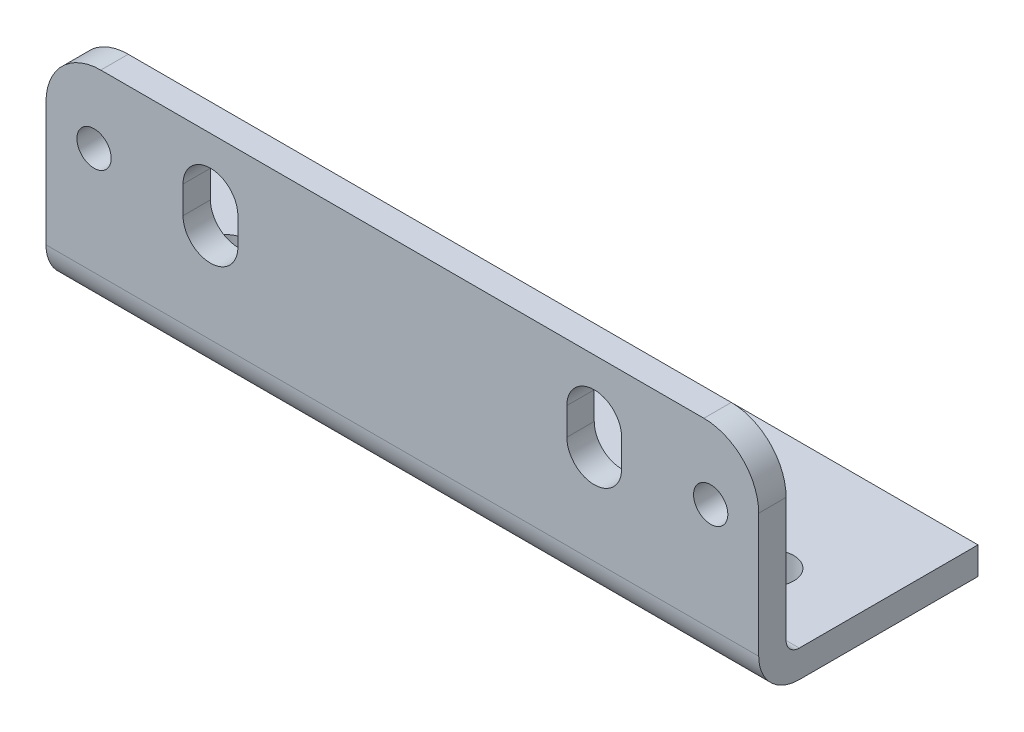
ISO-10303-21;
HEADER;
FILE_DESCRIPTION(('STEP AP214'),'2;1');
FILE_NAME('part.step','',(''),(''),'','','');
FILE_SCHEMA(('AUTOMOTIVE_DESIGN { 1 0 10303 214 1 1 1 1 }'));
ENDSEC;
DATA;
#1=APPLICATION_CONTEXT('core data for automotive mechanical design processes');
#2=APPLICATION_PROTOCOL_DEFINITION('international standard','automotive_design',2000,#1);
#3=PRODUCT_CONTEXT('',#1,'mechanical');
#4=PRODUCT('Part','Part','',(#3));
#5=PRODUCT_RELATED_PRODUCT_CATEGORY('part','',(#4));
#6=PRODUCT_DEFINITION_FORMATION('','',#4);
#7=PRODUCT_DEFINITION_CONTEXT('part definition',#1,'design');
#8=PRODUCT_DEFINITION('design','',#6,#7);
#9=PRODUCT_DEFINITION_SHAPE('','',#8);
#10=(LENGTH_UNIT() NAMED_UNIT(*) SI_UNIT(.MILLI.,.METRE.));
#11=(NAMED_UNIT(*) PLANE_ANGLE_UNIT() SI_UNIT($,.RADIAN.));
#12=(NAMED_UNIT(*) SI_UNIT($,.STERADIAN.) SOLID_ANGLE_UNIT());
#13=UNCERTAINTY_MEASURE_WITH_UNIT(LENGTH_MEASURE(1.E-05),#10,'distance_accuracy_value','');
#14=(GEOMETRIC_REPRESENTATION_CONTEXT(3) GLOBAL_UNCERTAINTY_ASSIGNED_CONTEXT((#13)) GLOBAL_UNIT_ASSIGNED_CONTEXT((#10,
#11,#12)) REPRESENTATION_CONTEXT('',''));
#15=CARTESIAN_POINT('',(0.,0.,0.));
#16=DIRECTION('',(0.,0.,1.));
#17=DIRECTION('',(1.,0.,0.));
#18=AXIS2_PLACEMENT_3D('',#15,#16,#17);
#19=CARTESIAN_POINT('',(-41.275,25.4,0.));
#20=DIRECTION('',(0.,-1.,0.));
#21=DIRECTION('',(0.,0.,-1.));
#22=AXIS2_PLACEMENT_3D('',#19,#20,#21);
#23=PLANE('',#22);
#24=DIRECTION('',(0.,0.,1.));
#25=VECTOR('',#24,1.);
#26=CARTESIAN_POINT('',(34.925,25.4000000000004,-4.69899999999999));
#27=LINE('',#26,#25);
#28=CARTESIAN_POINT('',(34.925,25.4000000000004,-3.17499999999998));
#29=VERTEX_POINT('',#28);
#30=CARTESIAN_POINT('',(34.925,25.4000000000004,0.));
#31=VERTEX_POINT('',#30);
#32=EDGE_CURVE('E153',#29,#31,#27,.T.);
#33=ORIENTED_EDGE('',*,*,#32,.F.);
#34=DIRECTION('',(1.,0.,0.));
#35=VECTOR('',#34,1.);
#36=CARTESIAN_POINT('',(-41.275,25.4,-3.17499999999992));
#37=LINE('',#36,#35);
#38=CARTESIAN_POINT('',(-34.925,25.4,-3.17499999999993));
#39=VERTEX_POINT('',#38);
#40=EDGE_CURVE('E245',#29,#39,#37,.F.);
#41=ORIENTED_EDGE('',*,*,#40,.T.);
#42=DIRECTION('',(0.,0.,1.));
#43=VECTOR('',#42,1.);
#44=CARTESIAN_POINT('',(-34.925,25.4,0.));
#45=LINE('',#44,#43);
#46=CARTESIAN_POINT('',(-34.925,25.4,0.));
#47=VERTEX_POINT('',#46);
#48=EDGE_CURVE('E195',#47,#39,#45,.F.);
#49=ORIENTED_EDGE('',*,*,#48,.F.);
#50=DIRECTION('',(1.,0.,0.));
#51=VECTOR('',#50,1.);
#52=CARTESIAN_POINT('',(-41.275,25.4,0.));
#53=LINE('',#52,#51);
#54=EDGE_CURVE('E156',#31,#47,#53,.F.);
#55=ORIENTED_EDGE('',*,*,#54,.F.);
#56=EDGE_LOOP('',(#33,#41,#49,#55));
#57=FACE_BOUND('',#56,.T.);
#58=ADVANCED_FACE('F25',(#57),#23,.F.);
#59=CARTESIAN_POINT('',(-25.4,15.5575000000004,-90.0267876801122));
#60=DIRECTION('',(1.,0.,0.));
#61=DIRECTION('',(0.,0.,-1.));
#62=AXIS2_PLACEMENT_3D('',#59,#60,#61);
#63=PLANE('',#62);
#64=DIRECTION('',(0.,1.,0.));
#65=VECTOR('',#64,1.);
#66=CARTESIAN_POINT('',(-25.4000000000001,4.44089209850063E-13,0.));
#67=LINE('',#66,#65);
#68=CARTESIAN_POINT('',(-25.4000000000001,15.5575000000004,0.));
#69=VERTEX_POINT('',#68);
#70=CARTESIAN_POINT('',(-25.4000000000002,18.7325000000004,0.));
#71=VERTEX_POINT('',#70);
#72=EDGE_CURVE('E265',#69,#71,#67,.T.);
#73=ORIENTED_EDGE('',*,*,#72,.F.);
#74=DIRECTION('',(0.,0.,-1.));
#75=VECTOR('',#74,1.);
#76=CARTESIAN_POINT('',(-25.4,15.5575000000004,-90.0267876801122));
#77=LINE('',#76,#75);
#78=CARTESIAN_POINT('',(-25.4000000000001,15.5575000000004,-3.17499999999996));
#79=VERTEX_POINT('',#78);
#80=EDGE_CURVE('E185',#69,#79,#77,.T.);
#81=ORIENTED_EDGE('',*,*,#80,.T.);
#82=DIRECTION('',(0.,1.,0.));
#83=VECTOR('',#82,1.);
#84=CARTESIAN_POINT('',(-25.4000000000001,4.44089209850063E-13,-3.17499999999999));
#85=LINE('',#84,#83);
#86=CARTESIAN_POINT('',(-25.4000000000002,18.7325000000004,-3.17499999999995));
#87=VERTEX_POINT('',#86);
#88=EDGE_CURVE('E242',#79,#87,#85,.T.);
#89=ORIENTED_EDGE('',*,*,#88,.T.);
#90=DIRECTION('',(0.,0.,-1.));
#91=VECTOR('',#90,1.);
#92=CARTESIAN_POINT('',(-25.4,18.7325000000004,-90.0267876801122));
#93=LINE('',#92,#91);
#94=EDGE_CURVE('E192',#87,#71,#93,.F.);
#95=ORIENTED_EDGE('',*,*,#94,.T.);
#96=EDGE_LOOP('',(#73,#81,#89,#95));
#97=FACE_BOUND('',#96,.T.);
#98=ADVANCED_FACE('F521',(#97),#63,.T.);
#99=CARTESIAN_POINT('',(-22.225,18.7325000000004,-90.0267876801123));
#100=DIRECTION('',(0.,0.,-1.));
#101=DIRECTION('',(-1.,0.,0.));
#102=AXIS2_PLACEMENT_3D('',#99,#100,#101);
#103=CYLINDRICAL_SURFACE('',#102,3.175);
#104=DIRECTION('',(0.,0.,1.));
#105=VECTOR('',#104,1.);
#106=CARTESIAN_POINT('',(-19.05,18.7325,-90.0267876801123));
#107=LINE('',#106,#105);
#108=CARTESIAN_POINT('',(-19.0500000000001,18.7325,0.));
#109=VERTEX_POINT('',#108);
#110=CARTESIAN_POINT('',(-19.0500000000001,18.7325,-3.17499999999995));
#111=VERTEX_POINT('',#110);
#112=EDGE_CURVE('E189',#109,#111,#107,.F.);
#113=ORIENTED_EDGE('',*,*,#112,.F.);
#114=CARTESIAN_POINT('',(-22.2250000000001,18.7325000000004,0.));
#115=DIRECTION('',(0.,0.,-1.));
#116=DIRECTION('',(-1.,0.,0.));
#117=AXIS2_PLACEMENT_3D('',#114,#115,#116);
#118=CIRCLE('',#117,3.175);
#119=EDGE_CURVE('E263',#71,#109,#118,.T.);
#120=ORIENTED_EDGE('',*,*,#119,.F.);
#121=ORIENTED_EDGE('',*,*,#94,.F.);
#122=CARTESIAN_POINT('',(-22.2250000000001,18.7325000000004,-3.17499999999995));
#123=DIRECTION('',(0.,0.,-1.));
#124=DIRECTION('',(-1.,0.,0.));
#125=AXIS2_PLACEMENT_3D('',#122,#123,#124);
#126=CIRCLE('',#125,3.175);
#127=EDGE_CURVE('E240',#87,#111,#126,.T.);
#128=ORIENTED_EDGE('',*,*,#127,.T.);
#129=EDGE_LOOP('',(#113,#120,#121,#128));
#130=FACE_BOUND('',#129,.T.);
#131=ADVANCED_FACE('F513',(#130),#103,.F.);
#132=CARTESIAN_POINT('',(-19.05,18.7325,-90.0267876801123));
#133=DIRECTION('',(-1.,0.,0.));
#134=DIRECTION('',(0.,0.,1.));
#135=AXIS2_PLACEMENT_3D('',#132,#133,#134);
#136=PLANE('',#135);
#137=DIRECTION('',(0.,1.,0.));
#138=VECTOR('',#137,1.);
#139=CARTESIAN_POINT('',(-19.05,0.,0.));
#140=LINE('',#139,#138);
#141=CARTESIAN_POINT('',(-19.05,15.5575,0.));
#142=VERTEX_POINT('',#141);
#143=EDGE_CURVE('E268',#109,#142,#140,.F.);
#144=ORIENTED_EDGE('',*,*,#143,.F.);
#145=ORIENTED_EDGE('',*,*,#112,.T.);
#146=DIRECTION('',(0.,1.,0.));
#147=VECTOR('',#146,1.);
#148=CARTESIAN_POINT('',(-19.05,0.,-3.17499999999999));
#149=LINE('',#148,#147);
#150=CARTESIAN_POINT('',(-19.05,15.5575,-3.17499999999996));
#151=VERTEX_POINT('',#150);
#152=EDGE_CURVE('E239',#111,#151,#149,.F.);
#153=ORIENTED_EDGE('',*,*,#152,.T.);
#154=DIRECTION('',(0.,0.,-1.));
#155=VECTOR('',#154,1.);
#156=CARTESIAN_POINT('',(-19.05,15.5575,-90.0267876801123));
#157=LINE('',#156,#155);
#158=EDGE_CURVE('E187',#151,#142,#157,.F.);
#159=ORIENTED_EDGE('',*,*,#158,.T.);
#160=EDGE_LOOP('',(#144,#145,#153,#159));
#161=FACE_BOUND('',#160,.T.);
#162=ADVANCED_FACE('F505',(#161),#136,.T.);
#163=CARTESIAN_POINT('',(-22.225,15.5575000000004,-90.0267876801123));
#164=DIRECTION('',(0.,0.,-1.));
#165=DIRECTION('',(-1.,0.,0.));
#166=AXIS2_PLACEMENT_3D('',#163,#164,#165);
#167=CYLINDRICAL_SURFACE('',#166,3.175);
#168=ORIENTED_EDGE('',*,*,#80,.F.);
#169=CARTESIAN_POINT('',(-22.225,15.5575000000004,0.));
#170=DIRECTION('',(0.,0.,-1.));
#171=DIRECTION('',(-1.,0.,0.));
#172=AXIS2_PLACEMENT_3D('',#169,#170,#171);
#173=CIRCLE('',#172,3.175);
#174=EDGE_CURVE('E266',#142,#69,#173,.T.);
#175=ORIENTED_EDGE('',*,*,#174,.F.);
#176=ORIENTED_EDGE('',*,*,#158,.F.);
#177=CARTESIAN_POINT('',(-22.225,15.5575000000004,-3.17499999999995));
#178=DIRECTION('',(0.,0.,-1.));
#179=DIRECTION('',(-1.,0.,0.));
#180=AXIS2_PLACEMENT_3D('',#177,#178,#179);
#181=CIRCLE('',#180,3.175);
#182=EDGE_CURVE('E236',#151,#79,#181,.T.);
#183=ORIENTED_EDGE('',*,*,#182,.T.);
#184=EDGE_LOOP('',(#168,#175,#176,#183));
#185=FACE_BOUND('',#184,.T.);
#186=ADVANCED_FACE('F497',(#185),#167,.F.);
#187=CARTESIAN_POINT('',(19.0500000000001,15.5575,-90.0267876801122));
#188=DIRECTION('',(1.,0.,0.));
#189=DIRECTION('',(0.,0.,-1.));
#190=AXIS2_PLACEMENT_3D('',#187,#188,#189);
#191=PLANE('',#190);
#192=DIRECTION('',(0.,1.,0.));
#193=VECTOR('',#192,1.);
#194=CARTESIAN_POINT('',(19.05,0.,0.));
#195=LINE('',#194,#193);
#196=CARTESIAN_POINT('',(19.05,15.5575,0.));
#197=VERTEX_POINT('',#196);
#198=CARTESIAN_POINT('',(19.05,18.7325,0.));
#199=VERTEX_POINT('',#198);
#200=EDGE_CURVE('E258',#197,#199,#195,.T.);
#201=ORIENTED_EDGE('',*,*,#200,.F.);
#202=DIRECTION('',(0.,0.,-1.));
#203=VECTOR('',#202,1.);
#204=CARTESIAN_POINT('',(19.0500000000001,15.5575,-90.0267876801122));
#205=LINE('',#204,#203);
#206=CARTESIAN_POINT('',(19.0500000000001,15.5575,-3.17499999999998));
#207=VERTEX_POINT('',#206);
#208=EDGE_CURVE('E176',#197,#207,#205,.T.);
#209=ORIENTED_EDGE('',*,*,#208,.T.);
#210=DIRECTION('',(0.,1.,0.));
#211=VECTOR('',#210,1.);
#212=CARTESIAN_POINT('',(19.0500000000001,0.,-3.17500000000001));
#213=LINE('',#212,#211);
#214=CARTESIAN_POINT('',(19.05,18.7325,-3.17499999999998));
#215=VERTEX_POINT('',#214);
#216=EDGE_CURVE('E235',#207,#215,#213,.T.);
#217=ORIENTED_EDGE('',*,*,#216,.T.);
#218=DIRECTION('',(0.,0.,-1.));
#219=VECTOR('',#218,1.);
#220=CARTESIAN_POINT('',(19.05,18.7325,-90.0267876801122));
#221=LINE('',#220,#219);
#222=EDGE_CURVE('E183',#215,#199,#221,.F.);
#223=ORIENTED_EDGE('',*,*,#222,.T.);
#224=EDGE_LOOP('',(#201,#209,#217,#223));
#225=FACE_BOUND('',#224,.T.);
#226=ADVANCED_FACE('F489',(#225),#191,.T.);
#227=CARTESIAN_POINT('',(22.225,18.7325,-90.0267876801123));
#228=DIRECTION('',(0.,0.,-1.));
#229=DIRECTION('',(-1.,0.,0.));
#230=AXIS2_PLACEMENT_3D('',#227,#228,#229);
#231=CYLINDRICAL_SURFACE('',#230,3.175);
#232=DIRECTION('',(0.,0.,1.));
#233=VECTOR('',#232,1.);
#234=CARTESIAN_POINT('',(25.4000000000001,18.7325,-90.0267876801123));
#235=LINE('',#234,#233);
#236=CARTESIAN_POINT('',(25.4,18.7325,0.));
#237=VERTEX_POINT('',#236);
#238=CARTESIAN_POINT('',(25.4000000000001,18.7325,-3.17499999999998));
#239=VERTEX_POINT('',#238);
#240=EDGE_CURVE('E180',#237,#239,#235,.F.);
#241=ORIENTED_EDGE('',*,*,#240,.F.);
#242=CARTESIAN_POINT('',(22.225,18.7325,0.));
#243=DIRECTION('',(0.,0.,-1.));
#244=DIRECTION('',(-1.,0.,0.));
#245=AXIS2_PLACEMENT_3D('',#242,#243,#244);
#246=CIRCLE('',#245,3.175);
#247=EDGE_CURVE('E255',#199,#237,#246,.T.);
#248=ORIENTED_EDGE('',*,*,#247,.F.);
#249=ORIENTED_EDGE('',*,*,#222,.F.);
#250=CARTESIAN_POINT('',(22.225,18.7325,-3.17499999999998));
#251=DIRECTION('',(0.,0.,-1.));
#252=DIRECTION('',(-1.,0.,0.));
#253=AXIS2_PLACEMENT_3D('',#250,#251,#252);
#254=CIRCLE('',#253,3.175);
#255=EDGE_CURVE('E233',#215,#239,#254,.T.);
#256=ORIENTED_EDGE('',*,*,#255,.T.);
#257=EDGE_LOOP('',(#241,#248,#249,#256));
#258=FACE_BOUND('',#257,.T.);
#259=ADVANCED_FACE('F481',(#258),#231,.F.);
#260=CARTESIAN_POINT('',(25.4000000000001,18.7325,-90.0267876801123));
#261=DIRECTION('',(-1.,0.,0.));
#262=DIRECTION('',(0.,0.,1.));
#263=AXIS2_PLACEMENT_3D('',#260,#261,#262);
#264=PLANE('',#263);
#265=DIRECTION('',(0.,1.,0.));
#266=VECTOR('',#265,1.);
#267=CARTESIAN_POINT('',(25.4000000000001,0.,0.));
#268=LINE('',#267,#266);
#269=CARTESIAN_POINT('',(25.4000000000001,15.5575,0.));
#270=VERTEX_POINT('',#269);
#271=EDGE_CURVE('E262',#237,#270,#268,.F.);
#272=ORIENTED_EDGE('',*,*,#271,.F.);
#273=ORIENTED_EDGE('',*,*,#240,.T.);
#274=DIRECTION('',(0.,1.,0.));
#275=VECTOR('',#274,1.);
#276=CARTESIAN_POINT('',(25.4000000000001,0.,-3.17500000000002));
#277=LINE('',#276,#275);
#278=CARTESIAN_POINT('',(25.4000000000001,15.5575,-3.17499999999999));
#279=VERTEX_POINT('',#278);
#280=EDGE_CURVE('E232',#239,#279,#277,.F.);
#281=ORIENTED_EDGE('',*,*,#280,.T.);
#282=DIRECTION('',(0.,0.,-1.));
#283=VECTOR('',#282,1.);
#284=CARTESIAN_POINT('',(25.4000000000001,15.5575,-90.0267876801123));
#285=LINE('',#284,#283);
#286=EDGE_CURVE('E178',#279,#270,#285,.F.);
#287=ORIENTED_EDGE('',*,*,#286,.T.);
#288=EDGE_LOOP('',(#272,#273,#281,#287));
#289=FACE_BOUND('',#288,.T.);
#290=ADVANCED_FACE('F473',(#289),#264,.T.);
#291=CARTESIAN_POINT('',(22.2250000000001,15.5575,-90.0267876801122));
#292=DIRECTION('',(0.,0.,-1.));
#293=DIRECTION('',(-1.,0.,0.));
#294=AXIS2_PLACEMENT_3D('',#291,#292,#293);
#295=CYLINDRICAL_SURFACE('',#294,3.175);
#296=ORIENTED_EDGE('',*,*,#208,.F.);
#297=CARTESIAN_POINT('',(22.2250000000001,15.5575,0.));
#298=DIRECTION('',(0.,0.,-1.));
#299=DIRECTION('',(-1.,0.,0.));
#300=AXIS2_PLACEMENT_3D('',#297,#298,#299);
#301=CIRCLE('',#300,3.175);
#302=EDGE_CURVE('E259',#270,#197,#301,.T.);
#303=ORIENTED_EDGE('',*,*,#302,.F.);
#304=ORIENTED_EDGE('',*,*,#286,.F.);
#305=CARTESIAN_POINT('',(22.2250000000001,15.5575,-3.17499999999999));
#306=DIRECTION('',(0.,0.,-1.));
#307=DIRECTION('',(-1.,0.,0.));
#308=AXIS2_PLACEMENT_3D('',#305,#306,#307);
#309=CIRCLE('',#308,3.175);
#310=EDGE_CURVE('E229',#279,#207,#309,.T.);
#311=ORIENTED_EDGE('',*,*,#310,.T.);
#312=EDGE_LOOP('',(#296,#303,#304,#311));
#313=FACE_BOUND('',#312,.T.);
#314=ADVANCED_FACE('F465',(#313),#295,.F.);
#315=CARTESIAN_POINT('',(-35.7124,17.145,-90.0267876801121));
#316=DIRECTION('',(0.,0.,-1.));
#317=DIRECTION('',(-1.,0.,0.));
#318=AXIS2_PLACEMENT_3D('',#315,#316,#317);
#319=CYLINDRICAL_SURFACE('',#318,1.984375);
#320=CARTESIAN_POINT('',(-35.7124,17.145,0.));
#321=DIRECTION('',(0.,0.,-1.));
#322=DIRECTION('',(-1.,0.,0.));
#323=AXIS2_PLACEMENT_3D('',#320,#321,#322);
#324=CIRCLE('',#323,1.984375);
#325=CARTESIAN_POINT('',(-37.696775,17.145,0.));
#326=VERTEX_POINT('',#325);
#327=EDGE_CURVE('E252',#326,#326,#324,.T.);
#328=ORIENTED_EDGE('',*,*,#327,.F.);
#329=EDGE_LOOP('',(#328));
#330=FACE_BOUND('',#329,.T.);
#331=CARTESIAN_POINT('',(-35.7124,17.145,-3.17499999999995));
#332=DIRECTION('',(0.,0.,-1.));
#333=DIRECTION('',(-1.,0.,0.));
#334=AXIS2_PLACEMENT_3D('',#331,#332,#333);
#335=CIRCLE('',#334,1.984375);
#336=CARTESIAN_POINT('',(-37.696775,17.145,-3.17499999999994));
#337=VERTEX_POINT('',#336);
#338=EDGE_CURVE('E226',#337,#337,#335,.T.);
#339=ORIENTED_EDGE('',*,*,#338,.T.);
#340=EDGE_LOOP('',(#339));
#341=FACE_BOUND('',#340,.T.);
#342=ADVANCED_FACE('F457',(#330,#341),#319,.F.);
#343=CARTESIAN_POINT('',(35.7124000000002,17.145,-90.0267876801122));
#344=DIRECTION('',(0.,0.,-1.));
#345=DIRECTION('',(-1.,0.,0.));
#346=AXIS2_PLACEMENT_3D('',#343,#344,#345);
#347=CYLINDRICAL_SURFACE('',#346,1.984375);
#348=CARTESIAN_POINT('',(35.7124000000002,17.1450000000004,0.));
#349=DIRECTION('',(0.,0.,-1.));
#350=DIRECTION('',(-1.,0.,0.));
#351=AXIS2_PLACEMENT_3D('',#348,#349,#350);
#352=CIRCLE('',#351,1.984375);
#353=CARTESIAN_POINT('',(33.7280250000002,17.1450000000004,0.));
#354=VERTEX_POINT('',#353);
#355=EDGE_CURVE('E249',#354,#354,#352,.T.);
#356=ORIENTED_EDGE('',*,*,#355,.F.);
#357=EDGE_LOOP('',(#356));
#358=FACE_BOUND('',#357,.T.);
#359=CARTESIAN_POINT('',(35.7124000000002,17.1450000000004,-3.17499999999999));
#360=DIRECTION('',(0.,0.,-1.));
#361=DIRECTION('',(-1.,0.,0.));
#362=AXIS2_PLACEMENT_3D('',#359,#360,#361);
#363=CIRCLE('',#362,1.984375);
#364=CARTESIAN_POINT('',(33.7280250000002,17.1450000000004,-3.17499999999999));
#365=VERTEX_POINT('',#364);
#366=EDGE_CURVE('E222',#365,#365,#363,.T.);
#367=ORIENTED_EDGE('',*,*,#366,.T.);
#368=EDGE_LOOP('',(#367));
#369=FACE_BOUND('',#368,.T.);
#370=ADVANCED_FACE('F450',(#358,#369),#347,.F.);
#371=CARTESIAN_POINT('',(34.925,19.0500000000005,-4.699));
#372=DIRECTION('',(0.,0.,1.));
#373=DIRECTION('',(1.,0.,0.));
#374=AXIS2_PLACEMENT_3D('',#371,#372,#373);
#375=CYLINDRICAL_SURFACE('',#374,6.35);
#376=CARTESIAN_POINT('',(34.925,19.0500000000005,0.));
#377=DIRECTION('',(0.,0.,1.));
#378=DIRECTION('',(1.,0.,0.));
#379=AXIS2_PLACEMENT_3D('',#376,#377,#378);
#380=CIRCLE('',#379,6.35);
#381=CARTESIAN_POINT('',(41.2750000000001,19.0500000000004,0.));
#382=VERTEX_POINT('',#381);
#383=EDGE_CURVE('E28',#382,#31,#380,.T.);
#384=ORIENTED_EDGE('',*,*,#383,.F.);
#385=DIRECTION('',(0.,0.,1.));
#386=VECTOR('',#385,1.);
#387=CARTESIAN_POINT('',(41.2750000000001,19.0500000000004,-4.699));
#388=LINE('',#387,#386);
#389=CARTESIAN_POINT('',(41.2750000000001,19.0500000000004,-3.175));
#390=VERTEX_POINT('',#389);
#391=EDGE_CURVE('E151',#390,#382,#388,.T.);
#392=ORIENTED_EDGE('',*,*,#391,.F.);
#393=CARTESIAN_POINT('',(34.925,19.0500000000005,-3.17499999999999));
#394=DIRECTION('',(0.,0.,1.));
#395=DIRECTION('',(1.,0.,0.));
#396=AXIS2_PLACEMENT_3D('',#393,#394,#395);
#397=CIRCLE('',#396,6.35);
#398=EDGE_CURVE('E243',#390,#29,#397,.T.);
#399=ORIENTED_EDGE('',*,*,#398,.T.);
#400=ORIENTED_EDGE('',*,*,#32,.T.);
#401=EDGE_LOOP('',(#384,#392,#399,#400));
#402=FACE_BOUND('',#401,.T.);
#403=ADVANCED_FACE('F148',(#402),#375,.T.);
#404=CARTESIAN_POINT('',(-41.275,0.,0.));
#405=DIRECTION('',(0.,0.,1.));
#406=DIRECTION('',(1.,0.,0.));
#407=AXIS2_PLACEMENT_3D('',#404,#405,#406);
#408=PLANE('',#407);
#409=ORIENTED_EDGE('',*,*,#355,.T.);
#410=EDGE_LOOP('',(#409));
#411=FACE_BOUND('',#410,.T.);
#412=ORIENTED_EDGE('',*,*,#327,.T.);
#413=EDGE_LOOP('',(#412));
#414=FACE_BOUND('',#413,.T.);
#415=ORIENTED_EDGE('',*,*,#200,.T.);
#416=ORIENTED_EDGE('',*,*,#247,.T.);
#417=ORIENTED_EDGE('',*,*,#271,.T.);
#418=ORIENTED_EDGE('',*,*,#302,.T.);
#419=EDGE_LOOP('',(#415,#416,#417,#418));
#420=FACE_BOUND('',#419,.T.);
#421=ORIENTED_EDGE('',*,*,#72,.T.);
#422=ORIENTED_EDGE('',*,*,#119,.T.);
#423=ORIENTED_EDGE('',*,*,#143,.T.);
#424=ORIENTED_EDGE('',*,*,#174,.T.);
#425=EDGE_LOOP('',(#421,#422,#423,#424));
#426=FACE_BOUND('',#425,.T.);
#427=DIRECTION('',(0.,1.,0.));
#428=VECTOR('',#427,1.);
#429=CARTESIAN_POINT('',(-41.275,0.,0.));
#430=LINE('',#429,#428);
#431=CARTESIAN_POINT('',(-41.2750000000002,4.69900000000001,0.));
#432=VERTEX_POINT('',#431);
#433=CARTESIAN_POINT('',(-41.2750000000001,19.05,0.));
#434=VERTEX_POINT('',#433);
#435=EDGE_CURVE('E283',#432,#434,#430,.T.);
#436=ORIENTED_EDGE('',*,*,#435,.F.);
#437=DIRECTION('',(-1.,0.,0.));
#438=VECTOR('',#437,1.);
#439=CARTESIAN_POINT('',(-41.2750000000002,4.69900000000001,0.));
#440=LINE('',#439,#438);
#441=CARTESIAN_POINT('',(41.275,4.6990000000004,0.));
#442=VERTEX_POINT('',#441);
#443=EDGE_CURVE('E161',#442,#432,#440,.T.);
#444=ORIENTED_EDGE('',*,*,#443,.F.);
#445=DIRECTION('',(0.,1.,0.));
#446=VECTOR('',#445,1.);
#447=CARTESIAN_POINT('',(41.275,4.6990000000004,0.));
#448=LINE('',#447,#446);
#449=EDGE_CURVE('E158',#382,#442,#448,.F.);
#450=ORIENTED_EDGE('',*,*,#449,.F.);
#451=ORIENTED_EDGE('',*,*,#383,.T.);
#452=ORIENTED_EDGE('',*,*,#54,.T.);
#453=CARTESIAN_POINT('',(-34.9250000000001,19.05,0.));
#454=DIRECTION('',(0.,0.,1.));
#455=DIRECTION('',(1.,0.,0.));
#456=AXIS2_PLACEMENT_3D('',#453,#454,#455);
#457=CIRCLE('',#456,6.35);
#458=EDGE_CURVE('E197',#434,#47,#457,.F.);
#459=ORIENTED_EDGE('',*,*,#458,.F.);
#460=EDGE_LOOP('',(#436,#444,#450,#451,#452,#459));
#461=FACE_BOUND('',#460,.T.);
#462=ADVANCED_FACE('F159',(#411,#414,#420,#426,#461),#408,.T.);
#463=CARTESIAN_POINT('',(-34.9250000000001,19.05,0.));
#464=DIRECTION('',(0.,0.,1.));
#465=DIRECTION('',(1.,0.,0.));
#466=AXIS2_PLACEMENT_3D('',#463,#464,#465);
#467=CYLINDRICAL_SURFACE('',#466,6.35);
#468=ORIENTED_EDGE('',*,*,#458,.T.);
#469=ORIENTED_EDGE('',*,*,#48,.T.);
#470=CARTESIAN_POINT('',(-34.9250000000002,19.05,-3.17499999999994));
#471=DIRECTION('',(0.,0.,1.));
#472=DIRECTION('',(1.,0.,0.));
#473=AXIS2_PLACEMENT_3D('',#470,#471,#472);
#474=CIRCLE('',#473,6.35);
#475=CARTESIAN_POINT('',(-41.2750000000002,19.05,-3.17499999999994));
#476=VERTEX_POINT('',#475);
#477=EDGE_CURVE('E196',#39,#476,#474,.T.);
#478=ORIENTED_EDGE('',*,*,#477,.T.);
#479=DIRECTION('',(0.,0.,1.));
#480=VECTOR('',#479,1.);
#481=CARTESIAN_POINT('',(-41.2750000000001,19.05,0.));
#482=LINE('',#481,#480);
#483=EDGE_CURVE('E280',#434,#476,#482,.F.);
#484=ORIENTED_EDGE('',*,*,#483,.F.);
#485=EDGE_LOOP('',(#468,#469,#478,#484));
#486=FACE_BOUND('',#485,.T.);
#487=ADVANCED_FACE('F358',(#486),#467,.T.);
#488=CARTESIAN_POINT('',(-41.2750000000001,0.,-3.17499999999997));
#489=DIRECTION('',(0.,0.,1.));
#490=DIRECTION('',(1.,0.,0.));
#491=AXIS2_PLACEMENT_3D('',#488,#489,#490);
#492=PLANE('',#491);
#493=ORIENTED_EDGE('',*,*,#366,.F.);
#494=EDGE_LOOP('',(#493));
#495=FACE_BOUND('',#494,.T.);
#496=ORIENTED_EDGE('',*,*,#338,.F.);
#497=EDGE_LOOP('',(#496));
#498=FACE_BOUND('',#497,.T.);
#499=ORIENTED_EDGE('',*,*,#280,.F.);
#500=ORIENTED_EDGE('',*,*,#255,.F.);
#501=ORIENTED_EDGE('',*,*,#216,.F.);
#502=ORIENTED_EDGE('',*,*,#310,.F.);
#503=EDGE_LOOP('',(#499,#500,#501,#502));
#504=FACE_BOUND('',#503,.T.);
#505=ORIENTED_EDGE('',*,*,#152,.F.);
#506=ORIENTED_EDGE('',*,*,#127,.F.);
#507=ORIENTED_EDGE('',*,*,#88,.F.);
#508=ORIENTED_EDGE('',*,*,#182,.F.);
#509=EDGE_LOOP('',(#505,#506,#507,#508));
#510=FACE_BOUND('',#509,.T.);
#511=ORIENTED_EDGE('',*,*,#398,.F.);
#512=DIRECTION('',(0.,1.,0.));
#513=VECTOR('',#512,1.);
#514=CARTESIAN_POINT('',(41.275,4.6990000000004,-3.17500000000002));
#515=LINE('',#514,#513);
#516=CARTESIAN_POINT('',(41.275,4.6990000000004,-3.17500000000002));
#517=VERTEX_POINT('',#516);
#518=EDGE_CURVE('E169',#517,#390,#515,.T.);
#519=ORIENTED_EDGE('',*,*,#518,.F.);
#520=DIRECTION('',(-1.,0.,0.));
#521=VECTOR('',#520,1.);
#522=CARTESIAN_POINT('',(-41.2750000000002,4.69900000000001,-3.17499999999997));
#523=LINE('',#522,#521);
#524=CARTESIAN_POINT('',(-41.2750000000002,4.69900000000001,-3.17499999999997));
#525=VERTEX_POINT('',#524);
#526=EDGE_CURVE('E225',#517,#525,#523,.T.);
#527=ORIENTED_EDGE('',*,*,#526,.T.);
#528=DIRECTION('',(0.,1.,0.));
#529=VECTOR('',#528,1.);
#530=CARTESIAN_POINT('',(-41.2750000000001,0.,-3.17499999999997));
#531=LINE('',#530,#529);
#532=EDGE_CURVE('E217',#476,#525,#531,.F.);
#533=ORIENTED_EDGE('',*,*,#532,.F.);
#534=ORIENTED_EDGE('',*,*,#477,.F.);
#535=ORIENTED_EDGE('',*,*,#40,.F.);
#536=EDGE_LOOP('',(#511,#519,#527,#533,#534,#535));
#537=FACE_BOUND('',#536,.T.);
#538=ADVANCED_FACE('F351',(#495,#498,#504,#510,#537),#492,.F.);
#539=CARTESIAN_POINT('',(-41.2750000000002,4.69900000000001,-4.69899999999996));
#540=DIRECTION('',(-1.,0.,0.));
#541=DIRECTION('',(0.,0.,1.));
#542=AXIS2_PLACEMENT_3D('',#539,#540,#541);
#543=CYLINDRICAL_SURFACE('',#542,1.524);
#544=DIRECTION('',(1.,0.,0.));
#545=VECTOR('',#544,1.);
#546=CARTESIAN_POINT('',(-41.2750000000002,3.17500000000004,-4.69899999999997));
#547=LINE('',#546,#545);
#548=CARTESIAN_POINT('',(41.2750000000001,3.17500000000043,-4.69900000000003));
#549=VERTEX_POINT('',#548);
#550=CARTESIAN_POINT('',(-41.2750000000002,3.17500000000004,-4.69899999999997));
#551=VERTEX_POINT('',#550);
#552=EDGE_CURVE('E171',#549,#551,#547,.F.);
#553=ORIENTED_EDGE('',*,*,#552,.T.);
#554=CARTESIAN_POINT('',(-41.2750000000002,4.69900000000001,-4.69899999999996));
#555=DIRECTION('',(-1.,0.,0.));
#556=DIRECTION('',(0.,0.,1.));
#557=AXIS2_PLACEMENT_3D('',#554,#555,#556);
#558=CIRCLE('',#557,1.524);
#559=EDGE_CURVE('E214',#525,#551,#558,.F.);
#560=ORIENTED_EDGE('',*,*,#559,.F.);
#561=ORIENTED_EDGE('',*,*,#526,.F.);
#562=CARTESIAN_POINT('',(41.275,4.6990000000004,-4.69900000000003));
#563=DIRECTION('',(-1.,0.,0.));
#564=DIRECTION('',(0.,0.,1.));
#565=AXIS2_PLACEMENT_3D('',#562,#563,#564);
#566=CIRCLE('',#565,1.524);
#567=EDGE_CURVE('E220',#549,#517,#566,.T.);
#568=ORIENTED_EDGE('',*,*,#567,.F.);
#569=EDGE_LOOP('',(#553,#560,#561,#568));
#570=FACE_BOUND('',#569,.T.);
#571=ADVANCED_FACE('F348',(#570),#543,.F.);
#572=CARTESIAN_POINT('',(-41.2750000000001,3.17500000000004,0.));
#573=DIRECTION('',(0.,-1.,0.));
#574=DIRECTION('',(0.,0.,-1.));
#575=AXIS2_PLACEMENT_3D('',#572,#573,#574);
#576=PLANE('',#575);
#577=CARTESIAN_POINT('',(31.6738000000001,3.17499999999998,-11.1125));
#578=DIRECTION('',(0.,1.,0.));
#579=DIRECTION('',(0.,0.,1.));
#580=AXIS2_PLACEMENT_3D('',#577,#578,#579);
#581=CIRCLE('',#580,2.5527);
#582=CARTESIAN_POINT('',(31.6738000000001,3.17499999999999,-8.5598));
#583=VERTEX_POINT('',#582);
#584=EDGE_CURVE('E202',#583,#583,#581,.F.);
#585=ORIENTED_EDGE('',*,*,#584,.T.);
#586=EDGE_LOOP('',(#585));
#587=FACE_BOUND('',#586,.T.);
#588=CARTESIAN_POINT('',(-31.6738000000001,3.17499999999998,-11.1125));
#589=DIRECTION('',(0.,1.,0.));
#590=DIRECTION('',(0.,0.,1.));
#591=AXIS2_PLACEMENT_3D('',#588,#589,#590);
#592=CIRCLE('',#591,2.5527);
#593=CARTESIAN_POINT('',(-31.6738000000001,3.17499999999999,-8.55979999999997));
#594=VERTEX_POINT('',#593);
#595=EDGE_CURVE('E206',#594,#594,#592,.F.);
#596=ORIENTED_EDGE('',*,*,#595,.T.);
#597=EDGE_LOOP('',(#596));
#598=FACE_BOUND('',#597,.T.);
#599=DIRECTION('',(-1.,0.,0.));
#600=VECTOR('',#599,1.);
#601=CARTESIAN_POINT('',(-41.2750000000001,3.17500000000004,-25.4));
#602=LINE('',#601,#600);
#603=CARTESIAN_POINT('',(-41.2750000000001,3.17500000000004,-25.4));
#604=VERTEX_POINT('',#603);
#605=CARTESIAN_POINT('',(41.2750000000001,3.17500000000043,-25.4));
#606=VERTEX_POINT('',#605);
#607=EDGE_CURVE('E295',#604,#606,#602,.F.);
#608=ORIENTED_EDGE('',*,*,#607,.F.);
#609=DIRECTION('',(0.,0.,1.));
#610=VECTOR('',#609,1.);
#611=CARTESIAN_POINT('',(-41.2750000000001,3.17500000000004,0.));
#612=LINE('',#611,#610);
#613=EDGE_CURVE('E213',#551,#604,#612,.F.);
#614=ORIENTED_EDGE('',*,*,#613,.F.);
#615=ORIENTED_EDGE('',*,*,#552,.F.);
#616=DIRECTION('',(0.,0.,1.));
#617=VECTOR('',#616,1.);
#618=CARTESIAN_POINT('',(41.2750000000001,3.17500000000043,-4.69900000000003));
#619=LINE('',#618,#617);
#620=EDGE_CURVE('E164',#606,#549,#619,.T.);
#621=ORIENTED_EDGE('',*,*,#620,.F.);
#622=EDGE_LOOP('',(#608,#614,#615,#621));
#623=FACE_BOUND('',#622,.T.);
#624=ADVANCED_FACE('F335',(#587,#598,#623),#576,.F.);
#625=CARTESIAN_POINT('',(41.275,4.6990000000004,-4.69900000000003));
#626=DIRECTION('',(1.,0.,0.));
#627=DIRECTION('',(0.,1.,0.));
#628=AXIS2_PLACEMENT_3D('',#625,#626,#627);
#629=PLANE('',#628);
#630=ORIENTED_EDGE('',*,*,#620,.T.);
#631=ORIENTED_EDGE('',*,*,#567,.T.);
#632=ORIENTED_EDGE('',*,*,#518,.T.);
#633=ORIENTED_EDGE('',*,*,#391,.T.);
#634=ORIENTED_EDGE('',*,*,#449,.T.);
#635=CARTESIAN_POINT('',(41.275,4.6990000000004,-4.69900000000003));
#636=DIRECTION('',(-1.,0.,0.));
#637=DIRECTION('',(0.,0.,1.));
#638=AXIS2_PLACEMENT_3D('',#635,#636,#637);
#639=CIRCLE('',#638,4.699);
#640=CARTESIAN_POINT('',(41.2750000000001,4.44089209850063E-13,-4.69900000000003));
#641=VERTEX_POINT('',#640);
#642=EDGE_CURVE('E218',#641,#442,#639,.T.);
#643=ORIENTED_EDGE('',*,*,#642,.F.);
#644=DIRECTION('',(0.,0.,-1.));
#645=VECTOR('',#644,1.);
#646=CARTESIAN_POINT('',(41.2750000000001,4.44089209850063E-13,0.));
#647=LINE('',#646,#645);
#648=CARTESIAN_POINT('',(41.2750000000002,4.44089209850063E-13,-25.4));
#649=VERTEX_POINT('',#648);
#650=EDGE_CURVE('E205',#649,#641,#647,.F.);
#651=ORIENTED_EDGE('',*,*,#650,.F.);
#652=DIRECTION('',(0.,1.,0.));
#653=VECTOR('',#652,1.);
#654=CARTESIAN_POINT('',(41.2750000000002,4.44089209850063E-13,-25.4));
#655=LINE('',#654,#653);
#656=EDGE_CURVE('E209',#606,#649,#655,.F.);
#657=ORIENTED_EDGE('',*,*,#656,.F.);
#658=EDGE_LOOP('',(#630,#631,#632,#633,#634,#643,#651,#657));
#659=FACE_BOUND('',#658,.T.);
#660=ADVANCED_FACE('F167',(#659),#629,.T.);
#661=CARTESIAN_POINT('',(-41.2750000000002,4.69900000000001,-4.69899999999996));
#662=DIRECTION('',(-1.,0.,0.));
#663=DIRECTION('',(0.,0.,1.));
#664=AXIS2_PLACEMENT_3D('',#661,#662,#663);
#665=CYLINDRICAL_SURFACE('',#664,4.699);
#666=CARTESIAN_POINT('',(-41.2750000000002,4.69900000000001,-4.69899999999996));
#667=DIRECTION('',(-1.,0.,0.));
#668=DIRECTION('',(0.,0.,1.));
#669=AXIS2_PLACEMENT_3D('',#666,#667,#668);
#670=CIRCLE('',#669,4.699);
#671=CARTESIAN_POINT('',(-41.2750000000001,0.,-4.69899999999997));
#672=VERTEX_POINT('',#671);
#673=EDGE_CURVE('E210',#672,#432,#670,.T.);
#674=ORIENTED_EDGE('',*,*,#673,.F.);
#675=DIRECTION('',(1.,0.,0.));
#676=VECTOR('',#675,1.);
#677=CARTESIAN_POINT('',(-41.2750000000001,0.,-4.69899999999997));
#678=LINE('',#677,#676);
#679=EDGE_CURVE('E309',#641,#672,#678,.F.);
#680=ORIENTED_EDGE('',*,*,#679,.F.);
#681=ORIENTED_EDGE('',*,*,#642,.T.);
#682=ORIENTED_EDGE('',*,*,#443,.T.);
#683=EDGE_LOOP('',(#674,#680,#681,#682));
#684=FACE_BOUND('',#683,.T.);
#685=ADVANCED_FACE('F343',(#684),#665,.T.);
#686=CARTESIAN_POINT('',(-41.275,0.,0.));
#687=DIRECTION('',(-1.,0.,0.));
#688=DIRECTION('',(0.,0.,1.));
#689=AXIS2_PLACEMENT_3D('',#686,#687,#688);
#690=PLANE('',#689);
#691=DIRECTION('',(0.,0.,-1.));
#692=VECTOR('',#691,1.);
#693=CARTESIAN_POINT('',(-41.275,0.,0.));
#694=LINE('',#693,#692);
#695=CARTESIAN_POINT('',(-41.2750000000001,0.,-25.4));
#696=VERTEX_POINT('',#695);
#697=EDGE_CURVE('E317',#672,#696,#694,.T.);
#698=ORIENTED_EDGE('',*,*,#697,.F.);
#699=ORIENTED_EDGE('',*,*,#673,.T.);
#700=ORIENTED_EDGE('',*,*,#435,.T.);
#701=ORIENTED_EDGE('',*,*,#483,.T.);
#702=ORIENTED_EDGE('',*,*,#532,.T.);
#703=ORIENTED_EDGE('',*,*,#559,.T.);
#704=ORIENTED_EDGE('',*,*,#613,.T.);
#705=DIRECTION('',(0.,1.,0.));
#706=VECTOR('',#705,1.);
#707=CARTESIAN_POINT('',(-41.2750000000001,0.,-25.4));
#708=LINE('',#707,#706);
#709=EDGE_CURVE('E43',#696,#604,#708,.T.);
#710=ORIENTED_EDGE('',*,*,#709,.F.);
#711=EDGE_LOOP('',(#698,#699,#700,#701,#702,#703,#704,#710));
#712=FACE_BOUND('',#711,.T.);
#713=ADVANCED_FACE('F332',(#712),#690,.T.);
#714=CARTESIAN_POINT('',(-41.2750000000001,0.,-25.4));
#715=DIRECTION('',(0.,0.,-1.));
#716=DIRECTION('',(-1.,0.,0.));
#717=AXIS2_PLACEMENT_3D('',#714,#715,#716);
#718=PLANE('',#717);
#719=ORIENTED_EDGE('',*,*,#656,.T.);
#720=DIRECTION('',(1.,0.,0.));
#721=VECTOR('',#720,1.);
#722=CARTESIAN_POINT('',(-41.2750000000001,0.,-25.4));
#723=LINE('',#722,#721);
#724=EDGE_CURVE('E201',#696,#649,#723,.T.);
#725=ORIENTED_EDGE('',*,*,#724,.F.);
#726=ORIENTED_EDGE('',*,*,#709,.T.);
#727=ORIENTED_EDGE('',*,*,#607,.T.);
#728=EDGE_LOOP('',(#719,#725,#726,#727));
#729=FACE_BOUND('',#728,.T.);
#730=ADVANCED_FACE('F338',(#729),#718,.T.);
#731=CARTESIAN_POINT('',(-31.6738,90.0267876801122,-11.1124999999998));
#732=DIRECTION('',(0.,1.,0.));
#733=DIRECTION('',(0.,0.,1.));
#734=AXIS2_PLACEMENT_3D('',#731,#732,#733);
#735=CYLINDRICAL_SURFACE('',#734,2.5527);
#736=CARTESIAN_POINT('',(-31.6738,0.,-11.1125));
#737=DIRECTION('',(0.,1.,0.));
#738=DIRECTION('',(0.,0.,1.));
#739=AXIS2_PLACEMENT_3D('',#736,#737,#738);
#740=CIRCLE('',#739,2.5527);
#741=CARTESIAN_POINT('',(-31.6738,0.,-8.55979999999997));
#742=VERTEX_POINT('',#741);
#743=EDGE_CURVE('E34',#742,#742,#740,.T.);
#744=ORIENTED_EDGE('',*,*,#743,.F.);
#745=EDGE_LOOP('',(#744));
#746=FACE_BOUND('',#745,.T.);
#747=ORIENTED_EDGE('',*,*,#595,.F.);
#748=EDGE_LOOP('',(#747));
#749=FACE_BOUND('',#748,.T.);
#750=ADVANCED_FACE('F377',(#746,#749),#735,.F.);
#751=CARTESIAN_POINT('',(31.6738000000002,90.0267876801122,-11.1124999999999));
#752=DIRECTION('',(0.,1.,0.));
#753=DIRECTION('',(0.,0.,1.));
#754=AXIS2_PLACEMENT_3D('',#751,#752,#753);
#755=CYLINDRICAL_SURFACE('',#754,2.5527);
#756=CARTESIAN_POINT('',(31.6738000000002,0.,-11.1125));
#757=DIRECTION('',(0.,1.,0.));
#758=DIRECTION('',(0.,0.,1.));
#759=AXIS2_PLACEMENT_3D('',#756,#757,#758);
#760=CIRCLE('',#759,2.5527);
#761=CARTESIAN_POINT('',(31.6738000000002,0.,-8.55980000000003));
#762=VERTEX_POINT('',#761);
#763=EDGE_CURVE('E13',#762,#762,#760,.T.);
#764=ORIENTED_EDGE('',*,*,#763,.F.);
#765=EDGE_LOOP('',(#764));
#766=FACE_BOUND('',#765,.T.);
#767=ORIENTED_EDGE('',*,*,#584,.F.);
#768=EDGE_LOOP('',(#767));
#769=FACE_BOUND('',#768,.T.);
#770=ADVANCED_FACE('F371',(#766,#769),#755,.F.);
#771=CARTESIAN_POINT('',(-41.275,0.,0.));
#772=DIRECTION('',(0.,-1.,0.));
#773=DIRECTION('',(0.,0.,-1.));
#774=AXIS2_PLACEMENT_3D('',#771,#772,#773);
#775=PLANE('',#774);
#776=ORIENTED_EDGE('',*,*,#763,.T.);
#777=EDGE_LOOP('',(#776));
#778=FACE_BOUND('',#777,.T.);
#779=ORIENTED_EDGE('',*,*,#743,.T.);
#780=EDGE_LOOP('',(#779));
#781=FACE_BOUND('',#780,.T.);
#782=ORIENTED_EDGE('',*,*,#697,.T.);
#783=ORIENTED_EDGE('',*,*,#724,.T.);
#784=ORIENTED_EDGE('',*,*,#650,.T.);
#785=ORIENTED_EDGE('',*,*,#679,.T.);
#786=EDGE_LOOP('',(#782,#783,#784,#785));
#787=FACE_BOUND('',#786,.T.);
#788=ADVANCED_FACE('F340',(#778,#781,#787),#775,.T.);
#789=CLOSED_SHELL('',(#58,#98,#131,#162,#186,#226,#259,#290,#314,#342,#370,#403,#462,#487,#538,
#571,#624,#660,#685,#713,#730,#750,#770,#788));
#790=MANIFOLD_SOLID_BREP('B1',#789);
#791=ADVANCED_BREP_SHAPE_REPRESENTATION('',(#18,#790),#14);
#792=SHAPE_DEFINITION_REPRESENTATION(#9,#791);
ENDSEC;
END-ISO-10303-21;
